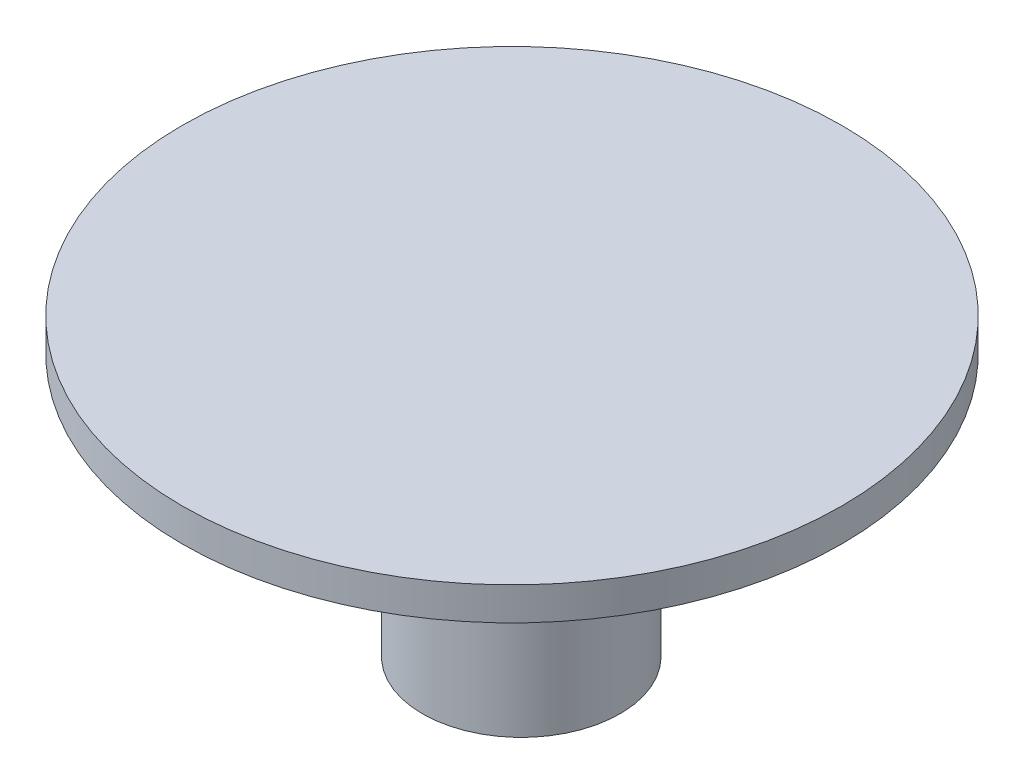
ISO-10303-21;
HEADER;
FILE_DESCRIPTION(('STEP AP214'),'2;1');
FILE_NAME('part.step','',(''),(''),'','','');
FILE_SCHEMA(('AUTOMOTIVE_DESIGN { 1 0 10303 214 1 1 1 1 }'));
ENDSEC;
DATA;
#1=APPLICATION_CONTEXT('core data for automotive mechanical design processes');
#2=APPLICATION_PROTOCOL_DEFINITION('international standard','automotive_design',2000,#1);
#3=PRODUCT_CONTEXT('',#1,'mechanical');
#4=PRODUCT('Part','Part','',(#3));
#5=PRODUCT_RELATED_PRODUCT_CATEGORY('part','',(#4));
#6=PRODUCT_DEFINITION_FORMATION('','',#4);
#7=PRODUCT_DEFINITION_CONTEXT('part definition',#1,'design');
#8=PRODUCT_DEFINITION('design','',#6,#7);
#9=PRODUCT_DEFINITION_SHAPE('','',#8);
#10=(LENGTH_UNIT() NAMED_UNIT(*) SI_UNIT(.MILLI.,.METRE.));
#11=(NAMED_UNIT(*) PLANE_ANGLE_UNIT() SI_UNIT($,.RADIAN.));
#12=(NAMED_UNIT(*) SI_UNIT($,.STERADIAN.) SOLID_ANGLE_UNIT());
#13=UNCERTAINTY_MEASURE_WITH_UNIT(LENGTH_MEASURE(1.E-05),#10,'distance_accuracy_value','');
#14=(GEOMETRIC_REPRESENTATION_CONTEXT(3) GLOBAL_UNCERTAINTY_ASSIGNED_CONTEXT((#13)) GLOBAL_UNIT_ASSIGNED_CONTEXT((#10,
#11,#12)) REPRESENTATION_CONTEXT('',''));
#15=CARTESIAN_POINT('',(0.,0.,0.));
#16=DIRECTION('',(0.,0.,1.));
#17=DIRECTION('',(1.,0.,0.));
#18=AXIS2_PLACEMENT_3D('',#15,#16,#17);
#19=CARTESIAN_POINT('',(-4.41662614358762,8.,-7.14351009706782));
#20=DIRECTION('',(0.,-1.,0.));
#21=DIRECTION('',(0.,0.,-1.));
#22=AXIS2_PLACEMENT_3D('',#19,#20,#21);
#23=CYLINDRICAL_SURFACE('',#22,3.);
#24=CARTESIAN_POINT('',(-4.41662614358762,8.,-7.14351009706782));
#25=DIRECTION('',(0.,1.,0.));
#26=DIRECTION('',(0.,0.,1.));
#27=AXIS2_PLACEMENT_3D('',#24,#25,#26);
#28=CIRCLE('',#27,3.);
#29=CARTESIAN_POINT('',(-4.41662614358762,8.,-4.14351009706782));
#30=VERTEX_POINT('',#29);
#31=EDGE_CURVE('E10',#30,#30,#28,.T.);
#32=ORIENTED_EDGE('',*,*,#31,.F.);
#33=EDGE_LOOP('',(#32));
#34=FACE_BOUND('',#33,.T.);
#35=CARTESIAN_POINT('',(-4.41662614358762,0.,-7.14351009706782));
#36=DIRECTION('',(0.,1.,0.));
#37=DIRECTION('',(0.,0.,1.));
#38=AXIS2_PLACEMENT_3D('',#35,#36,#37);
#39=CIRCLE('',#38,3.);
#40=CARTESIAN_POINT('',(-4.41662614358762,0.,-4.14351009706782));
#41=VERTEX_POINT('',#40);
#42=EDGE_CURVE('E44',#41,#41,#39,.T.);
#43=ORIENTED_EDGE('',*,*,#42,.T.);
#44=EDGE_LOOP('',(#43));
#45=FACE_BOUND('',#44,.T.);
#46=ADVANCED_FACE('F41',(#34,#45),#23,.T.);
#47=CARTESIAN_POINT('',(-4.41662614358762,0.,-7.14351009706782));
#48=DIRECTION('',(0.,1.,0.));
#49=DIRECTION('',(0.,0.,1.));
#50=AXIS2_PLACEMENT_3D('',#47,#48,#49);
#51=PLANE('',#50);
#52=ORIENTED_EDGE('',*,*,#42,.F.);
#53=EDGE_LOOP('',(#52));
#54=FACE_BOUND('',#53,.T.);
#55=ADVANCED_FACE('F68',(#54),#51,.F.);
#56=CARTESIAN_POINT('',(-4.52191109487319,9.,-6.96772919990363));
#57=DIRECTION('',(0.,-1.,0.));
#58=DIRECTION('',(0.,0.,-1.));
#59=AXIS2_PLACEMENT_3D('',#56,#57,#58);
#60=CYLINDRICAL_SURFACE('',#59,10.0063653106003);
#61=CARTESIAN_POINT('',(-4.52191109487319,9.,-6.96772919990363));
#62=DIRECTION('',(0.,1.,0.));
#63=DIRECTION('',(0.,0.,1.));
#64=AXIS2_PLACEMENT_3D('',#61,#62,#63);
#65=CIRCLE('',#64,10.0063653106003);
#66=CARTESIAN_POINT('',(-4.52191109487319,9.,3.03863611069663));
#67=VERTEX_POINT('',#66);
#68=EDGE_CURVE('E53',#67,#67,#65,.T.);
#69=ORIENTED_EDGE('',*,*,#68,.F.);
#70=EDGE_LOOP('',(#69));
#71=FACE_BOUND('',#70,.T.);
#72=CARTESIAN_POINT('',(-4.52191109487319,8.,-6.96772919990363));
#73=DIRECTION('',(0.,1.,0.));
#74=DIRECTION('',(0.,0.,1.));
#75=AXIS2_PLACEMENT_3D('',#72,#73,#74);
#76=CIRCLE('',#75,10.0063653106003);
#77=CARTESIAN_POINT('',(-4.52191109487319,8.,3.03863611069663));
#78=VERTEX_POINT('',#77);
#79=EDGE_CURVE('E55',#78,#78,#76,.T.);
#80=ORIENTED_EDGE('',*,*,#79,.T.);
#81=EDGE_LOOP('',(#80));
#82=FACE_BOUND('',#81,.T.);
#83=ADVANCED_FACE('F65',(#71,#82),#60,.T.);
#84=CARTESIAN_POINT('',(-4.52191109487319,9.,-6.96772919990363));
#85=DIRECTION('',(0.,1.,0.));
#86=DIRECTION('',(0.,0.,1.));
#87=AXIS2_PLACEMENT_3D('',#84,#85,#86);
#88=PLANE('',#87);
#89=ORIENTED_EDGE('',*,*,#68,.T.);
#90=EDGE_LOOP('',(#89));
#91=FACE_BOUND('',#90,.T.);
#92=ADVANCED_FACE('F63',(#91),#88,.T.);
#93=CARTESIAN_POINT('',(-4.52191109487319,8.,-6.96772919990363));
#94=DIRECTION('',(0.,1.,0.));
#95=DIRECTION('',(0.,0.,1.));
#96=AXIS2_PLACEMENT_3D('',#93,#94,#95);
#97=PLANE('',#96);
#98=ORIENTED_EDGE('',*,*,#31,.T.);
#99=EDGE_LOOP('',(#98));
#100=FACE_BOUND('',#99,.T.);
#101=ORIENTED_EDGE('',*,*,#79,.F.);
#102=EDGE_LOOP('',(#101));
#103=FACE_BOUND('',#102,.T.);
#104=ADVANCED_FACE('F72',(#100,#103),#97,.F.);
#105=CLOSED_SHELL('',(#46,#55,#83,#92,#104));
#106=MANIFOLD_SOLID_BREP('B2',#105);
#107=ADVANCED_BREP_SHAPE_REPRESENTATION('',(#18,#106),#14);
#108=SHAPE_DEFINITION_REPRESENTATION(#9,#107);
ENDSEC;
END-ISO-10303-21;
